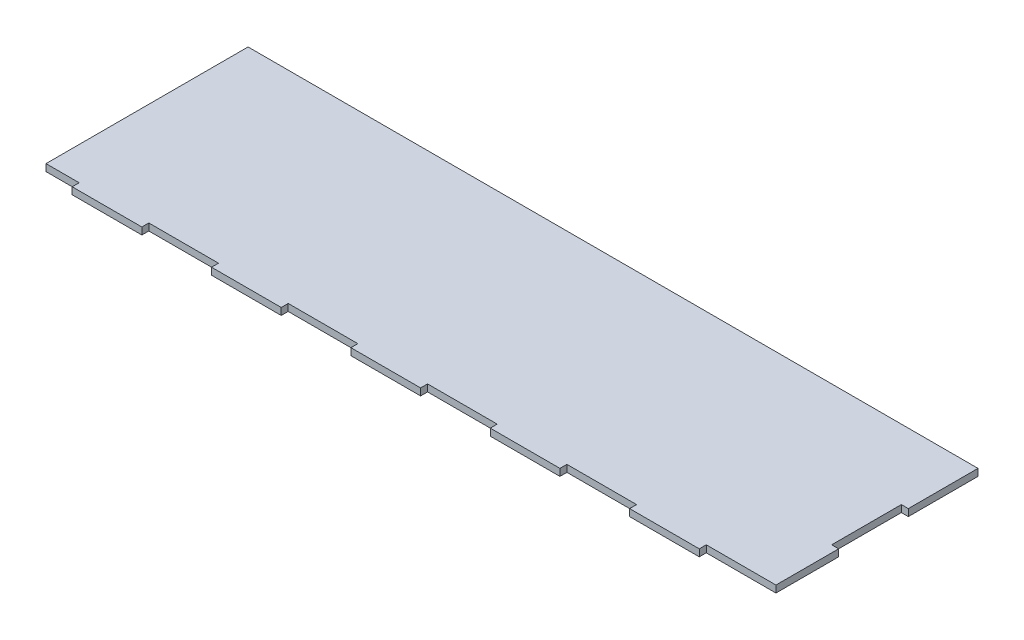
ISO-10303-21;
HEADER;
FILE_DESCRIPTION(('STEP AP214'),'2;1');
FILE_NAME('part.step','',(''),(''),'','','');
FILE_SCHEMA(('AUTOMOTIVE_DESIGN { 1 0 10303 214 1 1 1 1 }'));
ENDSEC;
DATA;
#1=APPLICATION_CONTEXT('core data for automotive mechanical design processes');
#2=APPLICATION_PROTOCOL_DEFINITION('international standard','automotive_design',2000,#1);
#3=PRODUCT_CONTEXT('',#1,'mechanical');
#4=PRODUCT('Part','Part','',(#3));
#5=PRODUCT_RELATED_PRODUCT_CATEGORY('part','',(#4));
#6=PRODUCT_DEFINITION_FORMATION('','',#4);
#7=PRODUCT_DEFINITION_CONTEXT('part definition',#1,'design');
#8=PRODUCT_DEFINITION('design','',#6,#7);
#9=PRODUCT_DEFINITION_SHAPE('','',#8);
#10=(LENGTH_UNIT() NAMED_UNIT(*) SI_UNIT(.MILLI.,.METRE.));
#11=(NAMED_UNIT(*) PLANE_ANGLE_UNIT() SI_UNIT($,.RADIAN.));
#12=(NAMED_UNIT(*) SI_UNIT($,.STERADIAN.) SOLID_ANGLE_UNIT());
#13=UNCERTAINTY_MEASURE_WITH_UNIT(LENGTH_MEASURE(1.E-05),#10,'distance_accuracy_value','');
#14=(GEOMETRIC_REPRESENTATION_CONTEXT(3) GLOBAL_UNCERTAINTY_ASSIGNED_CONTEXT((#13)) GLOBAL_UNIT_ASSIGNED_CONTEXT((#10,
#11,#12)) REPRESENTATION_CONTEXT('',''));
#15=CARTESIAN_POINT('',(0.,0.,0.));
#16=DIRECTION('',(0.,0.,1.));
#17=DIRECTION('',(1.,0.,0.));
#18=AXIS2_PLACEMENT_3D('',#15,#16,#17);
#19=CARTESIAN_POINT('',(0.725000000000031,0.,0.));
#20=DIRECTION('',(-1.,0.,0.));
#21=DIRECTION('',(0.,0.,1.));
#22=AXIS2_PLACEMENT_3D('',#19,#20,#21);
#23=PLANE('',#22);
#24=DIRECTION('',(0.,0.,-1.));
#25=VECTOR('',#24,1.);
#26=CARTESIAN_POINT('',(0.725000000000031,3.,0.));
#27=LINE('',#26,#25);
#28=CARTESIAN_POINT('',(0.725000000000031,3.,42.));
#29=VERTEX_POINT('',#28);
#30=CARTESIAN_POINT('',(0.725000000000031,3.,-45.));
#31=VERTEX_POINT('',#30);
#32=EDGE_CURVE('E242',#29,#31,#27,.T.);
#33=ORIENTED_EDGE('',*,*,#32,.T.);
#34=DIRECTION('',(0.,-1.,0.));
#35=VECTOR('',#34,1.);
#36=CARTESIAN_POINT('',(0.725000000000031,3.,-45.));
#37=LINE('',#36,#35);
#38=CARTESIAN_POINT('',(0.725000000000031,0.,-45.));
#39=VERTEX_POINT('',#38);
#40=EDGE_CURVE('E57',#31,#39,#37,.T.);
#41=ORIENTED_EDGE('',*,*,#40,.T.);
#42=DIRECTION('',(0.,0.,-1.));
#43=VECTOR('',#42,1.);
#44=CARTESIAN_POINT('',(0.725000000000031,0.,0.));
#45=LINE('',#44,#43);
#46=CARTESIAN_POINT('',(0.725000000000031,0.,42.));
#47=VERTEX_POINT('',#46);
#48=EDGE_CURVE('E65',#47,#39,#45,.T.);
#49=ORIENTED_EDGE('',*,*,#48,.F.);
#50=DIRECTION('',(0.,1.,0.));
#51=VECTOR('',#50,1.);
#52=CARTESIAN_POINT('',(0.725000000000031,0.,42.));
#53=LINE('',#52,#51);
#54=EDGE_CURVE('E12',#47,#29,#53,.T.);
#55=ORIENTED_EDGE('',*,*,#54,.T.);
#56=EDGE_LOOP('',(#33,#41,#49,#55));
#57=FACE_BOUND('',#56,.T.);
#58=ADVANCED_FACE('F41',(#57),#23,.T.);
#59=CARTESIAN_POINT('',(-315.,3.,-45.));
#60=DIRECTION('',(0.,0.,1.));
#61=DIRECTION('',(1.,0.,0.));
#62=AXIS2_PLACEMENT_3D('',#59,#60,#61);
#63=PLANE('',#62);
#64=ORIENTED_EDGE('',*,*,#40,.F.);
#65=DIRECTION('',(-1.,0.,0.));
#66=VECTOR('',#65,1.);
#67=CARTESIAN_POINT('',(-315.,3.,-45.));
#68=LINE('',#67,#66);
#69=CARTESIAN_POINT('',(315.,3.,-45.));
#70=VERTEX_POINT('',#69);
#71=EDGE_CURVE('E244',#70,#31,#68,.T.);
#72=ORIENTED_EDGE('',*,*,#71,.F.);
#73=DIRECTION('',(0.,-1.,0.));
#74=VECTOR('',#73,1.);
#75=CARTESIAN_POINT('',(315.,3.,-45.));
#76=LINE('',#75,#74);
#77=CARTESIAN_POINT('',(315.,0.,-45.));
#78=VERTEX_POINT('',#77);
#79=EDGE_CURVE('E486',#70,#78,#76,.T.);
#80=ORIENTED_EDGE('',*,*,#79,.T.);
#81=DIRECTION('',(-1.,0.,0.));
#82=VECTOR('',#81,1.);
#83=CARTESIAN_POINT('',(-315.,0.,-45.));
#84=LINE('',#83,#82);
#85=EDGE_CURVE('E477',#78,#39,#84,.T.);
#86=ORIENTED_EDGE('',*,*,#85,.T.);
#87=EDGE_LOOP('',(#64,#72,#80,#86));
#88=FACE_BOUND('',#87,.T.);
#89=ADVANCED_FACE('F569',(#88),#63,.F.);
#90=CARTESIAN_POINT('',(0.,3.,0.));
#91=DIRECTION('',(0.,-1.,0.));
#92=DIRECTION('',(0.,0.,-1.));
#93=AXIS2_PLACEMENT_3D('',#90,#91,#92);
#94=PLANE('',#93);
#95=ORIENTED_EDGE('',*,*,#32,.F.);
#96=DIRECTION('',(-1.,0.,0.));
#97=VECTOR('',#96,1.);
#98=CARTESIAN_POINT('',(-15.,3.,42.));
#99=LINE('',#98,#97);
#100=CARTESIAN_POINT('',(15.,3.,42.));
#101=VERTEX_POINT('',#100);
#102=EDGE_CURVE('E229',#101,#29,#99,.T.);
#103=ORIENTED_EDGE('',*,*,#102,.F.);
#104=DIRECTION('',(0.,0.,-1.));
#105=VECTOR('',#104,1.);
#106=CARTESIAN_POINT('',(15.,3.,45.));
#107=LINE('',#106,#105);
#108=CARTESIAN_POINT('',(15.,3.,45.));
#109=VERTEX_POINT('',#108);
#110=EDGE_CURVE('E239',#109,#101,#107,.T.);
#111=ORIENTED_EDGE('',*,*,#110,.F.);
#112=DIRECTION('',(1.,0.,0.));
#113=VECTOR('',#112,1.);
#114=CARTESIAN_POINT('',(-315.,3.,45.));
#115=LINE('',#114,#113);
#116=CARTESIAN_POINT('',(45.,3.,45.));
#117=VERTEX_POINT('',#116);
#118=EDGE_CURVE('E472',#109,#117,#115,.T.);
#119=ORIENTED_EDGE('',*,*,#118,.T.);
#120=DIRECTION('',(0.,0.,1.));
#121=VECTOR('',#120,1.);
#122=CARTESIAN_POINT('',(45.,3.,45.));
#123=LINE('',#122,#121);
#124=CARTESIAN_POINT('',(45.,3.,42.));
#125=VERTEX_POINT('',#124);
#126=EDGE_CURVE('E307',#125,#117,#123,.T.);
#127=ORIENTED_EDGE('',*,*,#126,.F.);
#128=DIRECTION('',(-1.,0.,0.));
#129=VECTOR('',#128,1.);
#130=CARTESIAN_POINT('',(45.,3.,42.));
#131=LINE('',#130,#129);
#132=CARTESIAN_POINT('',(75.,3.,42.));
#133=VERTEX_POINT('',#132);
#134=EDGE_CURVE('E298',#133,#125,#131,.T.);
#135=ORIENTED_EDGE('',*,*,#134,.F.);
#136=DIRECTION('',(0.,0.,-1.));
#137=VECTOR('',#136,1.);
#138=CARTESIAN_POINT('',(75.,3.,45.));
#139=LINE('',#138,#137);
#140=CARTESIAN_POINT('',(75.,3.,45.));
#141=VERTEX_POINT('',#140);
#142=EDGE_CURVE('E310',#141,#133,#139,.T.);
#143=ORIENTED_EDGE('',*,*,#142,.F.);
#144=CARTESIAN_POINT('',(105.,3.,45.));
#145=VERTEX_POINT('',#144);
#146=EDGE_CURVE('E837',#141,#145,#115,.T.);
#147=ORIENTED_EDGE('',*,*,#146,.T.);
#148=DIRECTION('',(0.,0.,1.));
#149=VECTOR('',#148,1.);
#150=CARTESIAN_POINT('',(105.,3.,45.));
#151=LINE('',#150,#149);
#152=CARTESIAN_POINT('',(105.,3.,42.));
#153=VERTEX_POINT('',#152);
#154=EDGE_CURVE('E343',#153,#145,#151,.T.);
#155=ORIENTED_EDGE('',*,*,#154,.F.);
#156=DIRECTION('',(-1.,0.,0.));
#157=VECTOR('',#156,1.);
#158=CARTESIAN_POINT('',(105.,3.,42.));
#159=LINE('',#158,#157);
#160=CARTESIAN_POINT('',(135.,3.,42.));
#161=VERTEX_POINT('',#160);
#162=EDGE_CURVE('E334',#161,#153,#159,.T.);
#163=ORIENTED_EDGE('',*,*,#162,.F.);
#164=DIRECTION('',(0.,0.,-1.));
#165=VECTOR('',#164,1.);
#166=CARTESIAN_POINT('',(135.,3.,45.));
#167=LINE('',#166,#165);
#168=CARTESIAN_POINT('',(135.,3.,45.));
#169=VERTEX_POINT('',#168);
#170=EDGE_CURVE('E346',#169,#161,#167,.T.);
#171=ORIENTED_EDGE('',*,*,#170,.F.);
#172=CARTESIAN_POINT('',(165.,3.,45.));
#173=VERTEX_POINT('',#172);
#174=EDGE_CURVE('E833',#169,#173,#115,.T.);
#175=ORIENTED_EDGE('',*,*,#174,.T.);
#176=DIRECTION('',(0.,0.,1.));
#177=VECTOR('',#176,1.);
#178=CARTESIAN_POINT('',(165.,3.,45.));
#179=LINE('',#178,#177);
#180=CARTESIAN_POINT('',(165.,3.,42.));
#181=VERTEX_POINT('',#180);
#182=EDGE_CURVE('E379',#181,#173,#179,.T.);
#183=ORIENTED_EDGE('',*,*,#182,.F.);
#184=DIRECTION('',(-1.,0.,0.));
#185=VECTOR('',#184,1.);
#186=CARTESIAN_POINT('',(165.,3.,42.));
#187=LINE('',#186,#185);
#188=CARTESIAN_POINT('',(195.,3.,42.));
#189=VERTEX_POINT('',#188);
#190=EDGE_CURVE('E370',#189,#181,#187,.T.);
#191=ORIENTED_EDGE('',*,*,#190,.F.);
#192=DIRECTION('',(0.,0.,-1.));
#193=VECTOR('',#192,1.);
#194=CARTESIAN_POINT('',(195.,3.,45.));
#195=LINE('',#194,#193);
#196=CARTESIAN_POINT('',(195.,3.,45.));
#197=VERTEX_POINT('',#196);
#198=EDGE_CURVE('E382',#197,#189,#195,.T.);
#199=ORIENTED_EDGE('',*,*,#198,.F.);
#200=CARTESIAN_POINT('',(225.,3.,45.));
#201=VERTEX_POINT('',#200);
#202=EDGE_CURVE('E471',#197,#201,#115,.T.);
#203=ORIENTED_EDGE('',*,*,#202,.T.);
#204=DIRECTION('',(0.,0.,1.));
#205=VECTOR('',#204,1.);
#206=CARTESIAN_POINT('',(225.,3.,45.));
#207=LINE('',#206,#205);
#208=CARTESIAN_POINT('',(225.,3.,42.));
#209=VERTEX_POINT('',#208);
#210=EDGE_CURVE('E415',#209,#201,#207,.T.);
#211=ORIENTED_EDGE('',*,*,#210,.F.);
#212=DIRECTION('',(-1.,0.,0.));
#213=VECTOR('',#212,1.);
#214=CARTESIAN_POINT('',(225.,3.,42.));
#215=LINE('',#214,#213);
#216=CARTESIAN_POINT('',(255.,3.,42.));
#217=VERTEX_POINT('',#216);
#218=EDGE_CURVE('E406',#217,#209,#215,.T.);
#219=ORIENTED_EDGE('',*,*,#218,.F.);
#220=DIRECTION('',(0.,0.,-1.));
#221=VECTOR('',#220,1.);
#222=CARTESIAN_POINT('',(255.,3.,45.));
#223=LINE('',#222,#221);
#224=CARTESIAN_POINT('',(255.,3.,45.));
#225=VERTEX_POINT('',#224);
#226=EDGE_CURVE('E418',#225,#217,#223,.T.);
#227=ORIENTED_EDGE('',*,*,#226,.F.);
#228=CARTESIAN_POINT('',(285.,3.,45.));
#229=VERTEX_POINT('',#228);
#230=EDGE_CURVE('E467',#225,#229,#115,.T.);
#231=ORIENTED_EDGE('',*,*,#230,.T.);
#232=DIRECTION('',(0.,0.,1.));
#233=VECTOR('',#232,1.);
#234=CARTESIAN_POINT('',(285.,3.,45.));
#235=LINE('',#234,#233);
#236=CARTESIAN_POINT('',(285.,3.,42.));
#237=VERTEX_POINT('',#236);
#238=EDGE_CURVE('E274',#237,#229,#235,.T.);
#239=ORIENTED_EDGE('',*,*,#238,.F.);
#240=DIRECTION('',(-1.,0.,0.));
#241=VECTOR('',#240,1.);
#242=CARTESIAN_POINT('',(285.,3.,42.));
#243=LINE('',#242,#241);
#244=CARTESIAN_POINT('',(315.,3.,42.));
#245=VERTEX_POINT('',#244);
#246=EDGE_CURVE('E442',#245,#237,#243,.T.);
#247=ORIENTED_EDGE('',*,*,#246,.F.);
#248=DIRECTION('',(0.,0.,-1.));
#249=VECTOR('',#248,1.);
#250=CARTESIAN_POINT('',(315.,3.,45.));
#251=LINE('',#250,#249);
#252=CARTESIAN_POINT('',(315.,3.,14.9999999985429));
#253=VERTEX_POINT('',#252);
#254=EDGE_CURVE('E460',#245,#253,#251,.T.);
#255=ORIENTED_EDGE('',*,*,#254,.T.);
#256=DIRECTION('',(-1.,0.,0.));
#257=VECTOR('',#256,1.);
#258=CARTESIAN_POINT('',(312.,3.,14.9999999985429));
#259=LINE('',#258,#257);
#260=CARTESIAN_POINT('',(312.,3.,14.9999999985429));
#261=VERTEX_POINT('',#260);
#262=EDGE_CURVE('E254',#253,#261,#259,.T.);
#263=ORIENTED_EDGE('',*,*,#262,.T.);
#264=DIRECTION('',(0.,0.,-1.));
#265=VECTOR('',#264,1.);
#266=CARTESIAN_POINT('',(312.,3.,14.9999999985429));
#267=LINE('',#266,#265);
#268=CARTESIAN_POINT('',(312.,3.,-15.0000000014571));
#269=VERTEX_POINT('',#268);
#270=EDGE_CURVE('E258',#261,#269,#267,.T.);
#271=ORIENTED_EDGE('',*,*,#270,.T.);
#272=DIRECTION('',(1.,0.,0.));
#273=VECTOR('',#272,1.);
#274=CARTESIAN_POINT('',(312.,3.,-15.0000000014571));
#275=LINE('',#274,#273);
#276=CARTESIAN_POINT('',(315.,3.,-15.0000000014571));
#277=VERTEX_POINT('',#276);
#278=EDGE_CURVE('E262',#269,#277,#275,.T.);
#279=ORIENTED_EDGE('',*,*,#278,.T.);
#280=EDGE_CURVE('E464',#277,#70,#251,.T.);
#281=ORIENTED_EDGE('',*,*,#280,.T.);
#282=ORIENTED_EDGE('',*,*,#71,.T.);
#283=EDGE_LOOP('',(#95,#103,#111,#119,#127,#135,#143,#147,#155,#163,#171,#175,#183,#191,#199,
#203,#211,#219,#227,#231,#239,#247,#255,#263,#271,#279,#281,#282));
#284=FACE_BOUND('',#283,.T.);
#285=ADVANCED_FACE('F243',(#284),#94,.F.);
#286=CARTESIAN_POINT('',(0.,0.,0.));
#287=DIRECTION('',(0.,-1.,0.));
#288=DIRECTION('',(0.,0.,-1.));
#289=AXIS2_PLACEMENT_3D('',#286,#287,#288);
#290=PLANE('',#289);
#291=DIRECTION('',(-1.,0.,0.));
#292=VECTOR('',#291,1.);
#293=CARTESIAN_POINT('',(-15.,0.,42.));
#294=LINE('',#293,#292);
#295=CARTESIAN_POINT('',(15.,0.,42.));
#296=VERTEX_POINT('',#295);
#297=EDGE_CURVE('E281',#296,#47,#294,.T.);
#298=ORIENTED_EDGE('',*,*,#297,.T.);
#299=ORIENTED_EDGE('',*,*,#48,.T.);
#300=ORIENTED_EDGE('',*,*,#85,.F.);
#301=DIRECTION('',(0.,0.,-1.));
#302=VECTOR('',#301,1.);
#303=CARTESIAN_POINT('',(315.,0.,45.));
#304=LINE('',#303,#302);
#305=CARTESIAN_POINT('',(315.,0.,-15.0000000014571));
#306=VERTEX_POINT('',#305);
#307=EDGE_CURVE('E290',#306,#78,#304,.T.);
#308=ORIENTED_EDGE('',*,*,#307,.F.);
#309=DIRECTION('',(1.,0.,0.));
#310=VECTOR('',#309,1.);
#311=CARTESIAN_POINT('',(0.,0.,-15.0000000014569));
#312=LINE('',#311,#310);
#313=CARTESIAN_POINT('',(312.,0.,-15.0000000014571));
#314=VERTEX_POINT('',#313);
#315=EDGE_CURVE('E50',#314,#306,#312,.T.);
#316=ORIENTED_EDGE('',*,*,#315,.F.);
#317=DIRECTION('',(0.,0.,-1.));
#318=VECTOR('',#317,1.);
#319=CARTESIAN_POINT('',(312.,0.,0.));
#320=LINE('',#319,#318);
#321=CARTESIAN_POINT('',(312.,0.,14.9999999985429));
#322=VERTEX_POINT('',#321);
#323=EDGE_CURVE('E494',#322,#314,#320,.T.);
#324=ORIENTED_EDGE('',*,*,#323,.F.);
#325=DIRECTION('',(-1.,0.,0.));
#326=VECTOR('',#325,1.);
#327=CARTESIAN_POINT('',(0.,0.,14.9999999985429));
#328=LINE('',#327,#326);
#329=CARTESIAN_POINT('',(315.,0.,14.9999999985429));
#330=VERTEX_POINT('',#329);
#331=EDGE_CURVE('E490',#330,#322,#328,.T.);
#332=ORIENTED_EDGE('',*,*,#331,.F.);
#333=CARTESIAN_POINT('',(315.,0.,42.));
#334=VERTEX_POINT('',#333);
#335=EDGE_CURVE('E473',#334,#330,#304,.T.);
#336=ORIENTED_EDGE('',*,*,#335,.F.);
#337=DIRECTION('',(-1.,0.,0.));
#338=VECTOR('',#337,1.);
#339=CARTESIAN_POINT('',(285.,0.,42.));
#340=LINE('',#339,#338);
#341=CARTESIAN_POINT('',(285.,0.,42.));
#342=VERTEX_POINT('',#341);
#343=EDGE_CURVE('E441',#334,#342,#340,.T.);
#344=ORIENTED_EDGE('',*,*,#343,.T.);
#345=DIRECTION('',(0.,0.,1.));
#346=VECTOR('',#345,1.);
#347=CARTESIAN_POINT('',(285.,0.,45.));
#348=LINE('',#347,#346);
#349=CARTESIAN_POINT('',(285.,0.,45.));
#350=VERTEX_POINT('',#349);
#351=EDGE_CURVE('E437',#342,#350,#348,.T.);
#352=ORIENTED_EDGE('',*,*,#351,.T.);
#353=DIRECTION('',(1.,0.,0.));
#354=VECTOR('',#353,1.);
#355=CARTESIAN_POINT('',(-315.,0.,45.));
#356=LINE('',#355,#354);
#357=CARTESIAN_POINT('',(255.,0.,45.));
#358=VERTEX_POINT('',#357);
#359=EDGE_CURVE('E480',#358,#350,#356,.T.);
#360=ORIENTED_EDGE('',*,*,#359,.F.);
#361=DIRECTION('',(0.,0.,-1.));
#362=VECTOR('',#361,1.);
#363=CARTESIAN_POINT('',(255.,0.,45.));
#364=LINE('',#363,#362);
#365=CARTESIAN_POINT('',(255.,0.,42.));
#366=VERTEX_POINT('',#365);
#367=EDGE_CURVE('E405',#358,#366,#364,.T.);
#368=ORIENTED_EDGE('',*,*,#367,.T.);
#369=DIRECTION('',(-1.,0.,0.));
#370=VECTOR('',#369,1.);
#371=CARTESIAN_POINT('',(225.,0.,42.));
#372=LINE('',#371,#370);
#373=CARTESIAN_POINT('',(225.,0.,42.));
#374=VERTEX_POINT('',#373);
#375=EDGE_CURVE('E410',#366,#374,#372,.T.);
#376=ORIENTED_EDGE('',*,*,#375,.T.);
#377=DIRECTION('',(0.,0.,1.));
#378=VECTOR('',#377,1.);
#379=CARTESIAN_POINT('',(225.,0.,45.));
#380=LINE('',#379,#378);
#381=CARTESIAN_POINT('',(225.,0.,45.));
#382=VERTEX_POINT('',#381);
#383=EDGE_CURVE('E401',#374,#382,#380,.T.);
#384=ORIENTED_EDGE('',*,*,#383,.T.);
#385=CARTESIAN_POINT('',(195.,0.,45.));
#386=VERTEX_POINT('',#385);
#387=EDGE_CURVE('E484',#386,#382,#356,.T.);
#388=ORIENTED_EDGE('',*,*,#387,.F.);
#389=DIRECTION('',(0.,0.,-1.));
#390=VECTOR('',#389,1.);
#391=CARTESIAN_POINT('',(195.,0.,45.));
#392=LINE('',#391,#390);
#393=CARTESIAN_POINT('',(195.,0.,42.));
#394=VERTEX_POINT('',#393);
#395=EDGE_CURVE('E369',#386,#394,#392,.T.);
#396=ORIENTED_EDGE('',*,*,#395,.T.);
#397=DIRECTION('',(-1.,0.,0.));
#398=VECTOR('',#397,1.);
#399=CARTESIAN_POINT('',(165.,0.,42.));
#400=LINE('',#399,#398);
#401=CARTESIAN_POINT('',(165.,0.,42.));
#402=VERTEX_POINT('',#401);
#403=EDGE_CURVE('E374',#394,#402,#400,.T.);
#404=ORIENTED_EDGE('',*,*,#403,.T.);
#405=DIRECTION('',(0.,0.,1.));
#406=VECTOR('',#405,1.);
#407=CARTESIAN_POINT('',(165.,0.,45.));
#408=LINE('',#407,#406);
#409=CARTESIAN_POINT('',(165.,0.,45.));
#410=VERTEX_POINT('',#409);
#411=EDGE_CURVE('E365',#402,#410,#408,.T.);
#412=ORIENTED_EDGE('',*,*,#411,.T.);
#413=CARTESIAN_POINT('',(135.,0.,45.));
#414=VERTEX_POINT('',#413);
#415=EDGE_CURVE('E548',#414,#410,#356,.T.);
#416=ORIENTED_EDGE('',*,*,#415,.F.);
#417=DIRECTION('',(0.,0.,-1.));
#418=VECTOR('',#417,1.);
#419=CARTESIAN_POINT('',(135.,0.,45.));
#420=LINE('',#419,#418);
#421=CARTESIAN_POINT('',(135.,0.,42.));
#422=VERTEX_POINT('',#421);
#423=EDGE_CURVE('E333',#414,#422,#420,.T.);
#424=ORIENTED_EDGE('',*,*,#423,.T.);
#425=DIRECTION('',(-1.,0.,0.));
#426=VECTOR('',#425,1.);
#427=CARTESIAN_POINT('',(105.,0.,42.));
#428=LINE('',#427,#426);
#429=CARTESIAN_POINT('',(105.,0.,42.));
#430=VERTEX_POINT('',#429);
#431=EDGE_CURVE('E338',#422,#430,#428,.T.);
#432=ORIENTED_EDGE('',*,*,#431,.T.);
#433=DIRECTION('',(0.,0.,1.));
#434=VECTOR('',#433,1.);
#435=CARTESIAN_POINT('',(105.,0.,45.));
#436=LINE('',#435,#434);
#437=CARTESIAN_POINT('',(105.,0.,45.));
#438=VERTEX_POINT('',#437);
#439=EDGE_CURVE('E329',#430,#438,#436,.T.);
#440=ORIENTED_EDGE('',*,*,#439,.T.);
#441=CARTESIAN_POINT('',(75.,0.,45.));
#442=VERTEX_POINT('',#441);
#443=EDGE_CURVE('E551',#442,#438,#356,.T.);
#444=ORIENTED_EDGE('',*,*,#443,.F.);
#445=DIRECTION('',(0.,0.,-1.));
#446=VECTOR('',#445,1.);
#447=CARTESIAN_POINT('',(75.,0.,45.));
#448=LINE('',#447,#446);
#449=CARTESIAN_POINT('',(75.,0.,42.));
#450=VERTEX_POINT('',#449);
#451=EDGE_CURVE('E297',#442,#450,#448,.T.);
#452=ORIENTED_EDGE('',*,*,#451,.T.);
#453=DIRECTION('',(-1.,0.,0.));
#454=VECTOR('',#453,1.);
#455=CARTESIAN_POINT('',(45.,0.,42.));
#456=LINE('',#455,#454);
#457=CARTESIAN_POINT('',(45.,0.,42.));
#458=VERTEX_POINT('',#457);
#459=EDGE_CURVE('E302',#450,#458,#456,.T.);
#460=ORIENTED_EDGE('',*,*,#459,.T.);
#461=DIRECTION('',(0.,0.,1.));
#462=VECTOR('',#461,1.);
#463=CARTESIAN_POINT('',(45.,0.,45.));
#464=LINE('',#463,#462);
#465=CARTESIAN_POINT('',(45.,0.,45.));
#466=VERTEX_POINT('',#465);
#467=EDGE_CURVE('E293',#458,#466,#464,.T.);
#468=ORIENTED_EDGE('',*,*,#467,.T.);
#469=CARTESIAN_POINT('',(15.,0.,45.));
#470=VERTEX_POINT('',#469);
#471=EDGE_CURVE('E485',#470,#466,#356,.T.);
#472=ORIENTED_EDGE('',*,*,#471,.F.);
#473=DIRECTION('',(0.,0.,-1.));
#474=VECTOR('',#473,1.);
#475=CARTESIAN_POINT('',(15.,0.,45.));
#476=LINE('',#475,#474);
#477=EDGE_CURVE('E238',#470,#296,#476,.T.);
#478=ORIENTED_EDGE('',*,*,#477,.T.);
#479=EDGE_LOOP('',(#298,#299,#300,#308,#316,#324,#332,#336,#344,#352,#360,#368,#376,#384,#388,
#396,#404,#412,#416,#424,#432,#440,#444,#452,#460,#468,#472,#478));
#480=FACE_BOUND('',#479,.T.);
#481=ADVANCED_FACE('F505',(#480),#290,.T.);
#482=CARTESIAN_POINT('',(-15.,0.,42.));
#483=DIRECTION('',(0.,0.,-1.));
#484=DIRECTION('',(-1.,0.,0.));
#485=AXIS2_PLACEMENT_3D('',#482,#483,#484);
#486=PLANE('',#485);
#487=ORIENTED_EDGE('',*,*,#54,.F.);
#488=ORIENTED_EDGE('',*,*,#297,.F.);
#489=DIRECTION('',(0.,1.,0.));
#490=VECTOR('',#489,1.);
#491=CARTESIAN_POINT('',(15.,0.,42.));
#492=LINE('',#491,#490);
#493=EDGE_CURVE('E233',#296,#101,#492,.T.);
#494=ORIENTED_EDGE('',*,*,#493,.T.);
#495=ORIENTED_EDGE('',*,*,#102,.T.);
#496=EDGE_LOOP('',(#487,#488,#494,#495));
#497=FACE_BOUND('',#496,.T.);
#498=ADVANCED_FACE('F231',(#497),#486,.F.);
#499=CARTESIAN_POINT('',(315.,3.,45.));
#500=DIRECTION('',(-1.,0.,0.));
#501=DIRECTION('',(0.,0.,1.));
#502=AXIS2_PLACEMENT_3D('',#499,#500,#501);
#503=PLANE('',#502);
#504=ORIENTED_EDGE('',*,*,#280,.F.);
#505=DIRECTION('',(0.,-1.,0.));
#506=VECTOR('',#505,1.);
#507=CARTESIAN_POINT('',(315.,3.,-15.0000000014571));
#508=LINE('',#507,#506);
#509=EDGE_CURVE('E265',#277,#306,#508,.T.);
#510=ORIENTED_EDGE('',*,*,#509,.T.);
#511=ORIENTED_EDGE('',*,*,#307,.T.);
#512=ORIENTED_EDGE('',*,*,#79,.F.);
#513=EDGE_LOOP('',(#504,#510,#511,#512));
#514=FACE_BOUND('',#513,.T.);
#515=ADVANCED_FACE('F570',(#514),#503,.F.);
#516=CARTESIAN_POINT('',(-315.,3.,45.));
#517=DIRECTION('',(0.,0.,-1.));
#518=DIRECTION('',(-1.,0.,0.));
#519=AXIS2_PLACEMENT_3D('',#516,#517,#518);
#520=PLANE('',#519);
#521=ORIENTED_EDGE('',*,*,#387,.T.);
#522=DIRECTION('',(0.,1.,0.));
#523=VECTOR('',#522,1.);
#524=CARTESIAN_POINT('',(225.,0.,45.));
#525=LINE('',#524,#523);
#526=EDGE_CURVE('E414',#382,#201,#525,.T.);
#527=ORIENTED_EDGE('',*,*,#526,.T.);
#528=ORIENTED_EDGE('',*,*,#202,.F.);
#529=DIRECTION('',(0.,1.,0.));
#530=VECTOR('',#529,1.);
#531=CARTESIAN_POINT('',(195.,0.,45.));
#532=LINE('',#531,#530);
#533=EDGE_CURVE('E395',#386,#197,#532,.T.);
#534=ORIENTED_EDGE('',*,*,#533,.F.);
#535=EDGE_LOOP('',(#521,#527,#528,#534));
#536=FACE_BOUND('',#535,.T.);
#537=ADVANCED_FACE('F544',(#536),#520,.F.);
#538=ORIENTED_EDGE('',*,*,#415,.T.);
#539=DIRECTION('',(0.,1.,0.));
#540=VECTOR('',#539,1.);
#541=CARTESIAN_POINT('',(165.,0.,45.));
#542=LINE('',#541,#540);
#543=EDGE_CURVE('E378',#410,#173,#542,.T.);
#544=ORIENTED_EDGE('',*,*,#543,.T.);
#545=ORIENTED_EDGE('',*,*,#174,.F.);
#546=DIRECTION('',(0.,1.,0.));
#547=VECTOR('',#546,1.);
#548=CARTESIAN_POINT('',(135.,0.,45.));
#549=LINE('',#548,#547);
#550=EDGE_CURVE('E359',#414,#169,#549,.T.);
#551=ORIENTED_EDGE('',*,*,#550,.F.);
#552=EDGE_LOOP('',(#538,#544,#545,#551));
#553=FACE_BOUND('',#552,.T.);
#554=ADVANCED_FACE('F577',(#553),#520,.F.);
#555=ORIENTED_EDGE('',*,*,#443,.T.);
#556=DIRECTION('',(0.,1.,0.));
#557=VECTOR('',#556,1.);
#558=CARTESIAN_POINT('',(105.,0.,45.));
#559=LINE('',#558,#557);
#560=EDGE_CURVE('E342',#438,#145,#559,.T.);
#561=ORIENTED_EDGE('',*,*,#560,.T.);
#562=ORIENTED_EDGE('',*,*,#146,.F.);
#563=DIRECTION('',(0.,1.,0.));
#564=VECTOR('',#563,1.);
#565=CARTESIAN_POINT('',(75.,0.,45.));
#566=LINE('',#565,#564);
#567=EDGE_CURVE('E323',#442,#141,#566,.T.);
#568=ORIENTED_EDGE('',*,*,#567,.F.);
#569=EDGE_LOOP('',(#555,#561,#562,#568));
#570=FACE_BOUND('',#569,.T.);
#571=ADVANCED_FACE('F651',(#570),#520,.F.);
#572=ORIENTED_EDGE('',*,*,#471,.T.);
#573=DIRECTION('',(0.,1.,0.));
#574=VECTOR('',#573,1.);
#575=CARTESIAN_POINT('',(45.,0.,45.));
#576=LINE('',#575,#574);
#577=EDGE_CURVE('E306',#466,#117,#576,.T.);
#578=ORIENTED_EDGE('',*,*,#577,.T.);
#579=ORIENTED_EDGE('',*,*,#118,.F.);
#580=DIRECTION('',(0.,1.,0.));
#581=VECTOR('',#580,1.);
#582=CARTESIAN_POINT('',(15.,0.,45.));
#583=LINE('',#582,#581);
#584=EDGE_CURVE('E284',#470,#109,#583,.T.);
#585=ORIENTED_EDGE('',*,*,#584,.F.);
#586=EDGE_LOOP('',(#572,#578,#579,#585));
#587=FACE_BOUND('',#586,.T.);
#588=ADVANCED_FACE('F581',(#587),#520,.F.);
#589=ORIENTED_EDGE('',*,*,#335,.T.);
#590=DIRECTION('',(0.,-1.,0.));
#591=VECTOR('',#590,1.);
#592=CARTESIAN_POINT('',(315.,3.,14.9999999985429));
#593=LINE('',#592,#591);
#594=EDGE_CURVE('E253',#253,#330,#593,.T.);
#595=ORIENTED_EDGE('',*,*,#594,.F.);
#596=ORIENTED_EDGE('',*,*,#254,.F.);
#597=DIRECTION('',(0.,1.,0.));
#598=VECTOR('',#597,1.);
#599=CARTESIAN_POINT('',(315.,0.,42.));
#600=LINE('',#599,#598);
#601=EDGE_CURVE('E454',#334,#245,#600,.T.);
#602=ORIENTED_EDGE('',*,*,#601,.F.);
#603=EDGE_LOOP('',(#589,#595,#596,#602));
#604=FACE_BOUND('',#603,.T.);
#605=ADVANCED_FACE('F43',(#604),#503,.F.);
#606=ORIENTED_EDGE('',*,*,#359,.T.);
#607=DIRECTION('',(0.,1.,0.));
#608=VECTOR('',#607,1.);
#609=CARTESIAN_POINT('',(285.,0.,45.));
#610=LINE('',#609,#608);
#611=EDGE_CURVE('E446',#350,#229,#610,.T.);
#612=ORIENTED_EDGE('',*,*,#611,.T.);
#613=ORIENTED_EDGE('',*,*,#230,.F.);
#614=DIRECTION('',(0.,1.,0.));
#615=VECTOR('',#614,1.);
#616=CARTESIAN_POINT('',(255.,0.,45.));
#617=LINE('',#616,#615);
#618=EDGE_CURVE('E431',#358,#225,#617,.T.);
#619=ORIENTED_EDGE('',*,*,#618,.F.);
#620=EDGE_LOOP('',(#606,#612,#613,#619));
#621=FACE_BOUND('',#620,.T.);
#622=ADVANCED_FACE('F527',(#621),#520,.F.);
#623=CARTESIAN_POINT('',(15.,0.,45.));
#624=DIRECTION('',(1.,0.,0.));
#625=DIRECTION('',(0.,0.,-1.));
#626=AXIS2_PLACEMENT_3D('',#623,#624,#625);
#627=PLANE('',#626);
#628=ORIENTED_EDGE('',*,*,#110,.T.);
#629=ORIENTED_EDGE('',*,*,#493,.F.);
#630=ORIENTED_EDGE('',*,*,#477,.F.);
#631=ORIENTED_EDGE('',*,*,#584,.T.);
#632=EDGE_LOOP('',(#628,#629,#630,#631));
#633=FACE_BOUND('',#632,.T.);
#634=ADVANCED_FACE('F594',(#633),#627,.F.);
#635=CARTESIAN_POINT('',(45.,0.,45.));
#636=DIRECTION('',(-1.,0.,0.));
#637=DIRECTION('',(0.,0.,1.));
#638=AXIS2_PLACEMENT_3D('',#635,#636,#637);
#639=PLANE('',#638);
#640=ORIENTED_EDGE('',*,*,#126,.T.);
#641=ORIENTED_EDGE('',*,*,#577,.F.);
#642=ORIENTED_EDGE('',*,*,#467,.F.);
#643=DIRECTION('',(0.,1.,0.));
#644=VECTOR('',#643,1.);
#645=CARTESIAN_POINT('',(45.,0.,42.));
#646=LINE('',#645,#644);
#647=EDGE_CURVE('E286',#458,#125,#646,.T.);
#648=ORIENTED_EDGE('',*,*,#647,.T.);
#649=EDGE_LOOP('',(#640,#641,#642,#648));
#650=FACE_BOUND('',#649,.T.);
#651=ADVANCED_FACE('F597',(#650),#639,.F.);
#652=CARTESIAN_POINT('',(45.,0.,42.));
#653=DIRECTION('',(0.,0.,-1.));
#654=DIRECTION('',(-1.,0.,0.));
#655=AXIS2_PLACEMENT_3D('',#652,#653,#654);
#656=PLANE('',#655);
#657=ORIENTED_EDGE('',*,*,#134,.T.);
#658=ORIENTED_EDGE('',*,*,#647,.F.);
#659=ORIENTED_EDGE('',*,*,#459,.F.);
#660=DIRECTION('',(0.,1.,0.));
#661=VECTOR('',#660,1.);
#662=CARTESIAN_POINT('',(75.,0.,42.));
#663=LINE('',#662,#661);
#664=EDGE_CURVE('E320',#450,#133,#663,.T.);
#665=ORIENTED_EDGE('',*,*,#664,.T.);
#666=EDGE_LOOP('',(#657,#658,#659,#665));
#667=FACE_BOUND('',#666,.T.);
#668=ADVANCED_FACE('F599',(#667),#656,.F.);
#669=CARTESIAN_POINT('',(75.,0.,45.));
#670=DIRECTION('',(1.,0.,0.));
#671=DIRECTION('',(0.,0.,-1.));
#672=AXIS2_PLACEMENT_3D('',#669,#670,#671);
#673=PLANE('',#672);
#674=ORIENTED_EDGE('',*,*,#142,.T.);
#675=ORIENTED_EDGE('',*,*,#664,.F.);
#676=ORIENTED_EDGE('',*,*,#451,.F.);
#677=ORIENTED_EDGE('',*,*,#567,.T.);
#678=EDGE_LOOP('',(#674,#675,#676,#677));
#679=FACE_BOUND('',#678,.T.);
#680=ADVANCED_FACE('F602',(#679),#673,.F.);
#681=CARTESIAN_POINT('',(105.,0.,45.));
#682=DIRECTION('',(-1.,0.,0.));
#683=DIRECTION('',(0.,0.,1.));
#684=AXIS2_PLACEMENT_3D('',#681,#682,#683);
#685=PLANE('',#684);
#686=ORIENTED_EDGE('',*,*,#154,.T.);
#687=ORIENTED_EDGE('',*,*,#560,.F.);
#688=ORIENTED_EDGE('',*,*,#439,.F.);
#689=DIRECTION('',(0.,1.,0.));
#690=VECTOR('',#689,1.);
#691=CARTESIAN_POINT('',(105.,0.,42.));
#692=LINE('',#691,#690);
#693=EDGE_CURVE('E311',#430,#153,#692,.T.);
#694=ORIENTED_EDGE('',*,*,#693,.T.);
#695=EDGE_LOOP('',(#686,#687,#688,#694));
#696=FACE_BOUND('',#695,.T.);
#697=ADVANCED_FACE('F606',(#696),#685,.F.);
#698=CARTESIAN_POINT('',(105.,0.,42.));
#699=DIRECTION('',(0.,0.,-1.));
#700=DIRECTION('',(-1.,0.,0.));
#701=AXIS2_PLACEMENT_3D('',#698,#699,#700);
#702=PLANE('',#701);
#703=ORIENTED_EDGE('',*,*,#162,.T.);
#704=ORIENTED_EDGE('',*,*,#693,.F.);
#705=ORIENTED_EDGE('',*,*,#431,.F.);
#706=DIRECTION('',(0.,1.,0.));
#707=VECTOR('',#706,1.);
#708=CARTESIAN_POINT('',(135.,0.,42.));
#709=LINE('',#708,#707);
#710=EDGE_CURVE('E356',#422,#161,#709,.T.);
#711=ORIENTED_EDGE('',*,*,#710,.T.);
#712=EDGE_LOOP('',(#703,#704,#705,#711));
#713=FACE_BOUND('',#712,.T.);
#714=ADVANCED_FACE('F611',(#713),#702,.F.);
#715=CARTESIAN_POINT('',(135.,0.,45.));
#716=DIRECTION('',(1.,0.,0.));
#717=DIRECTION('',(0.,0.,-1.));
#718=AXIS2_PLACEMENT_3D('',#715,#716,#717);
#719=PLANE('',#718);
#720=ORIENTED_EDGE('',*,*,#170,.T.);
#721=ORIENTED_EDGE('',*,*,#710,.F.);
#722=ORIENTED_EDGE('',*,*,#423,.F.);
#723=ORIENTED_EDGE('',*,*,#550,.T.);
#724=EDGE_LOOP('',(#720,#721,#722,#723));
#725=FACE_BOUND('',#724,.T.);
#726=ADVANCED_FACE('F614',(#725),#719,.F.);
#727=CARTESIAN_POINT('',(165.,0.,45.));
#728=DIRECTION('',(-1.,0.,0.));
#729=DIRECTION('',(0.,0.,1.));
#730=AXIS2_PLACEMENT_3D('',#727,#728,#729);
#731=PLANE('',#730);
#732=ORIENTED_EDGE('',*,*,#182,.T.);
#733=ORIENTED_EDGE('',*,*,#543,.F.);
#734=ORIENTED_EDGE('',*,*,#411,.F.);
#735=DIRECTION('',(0.,1.,0.));
#736=VECTOR('',#735,1.);
#737=CARTESIAN_POINT('',(165.,0.,42.));
#738=LINE('',#737,#736);
#739=EDGE_CURVE('E347',#402,#181,#738,.T.);
#740=ORIENTED_EDGE('',*,*,#739,.T.);
#741=EDGE_LOOP('',(#732,#733,#734,#740));
#742=FACE_BOUND('',#741,.T.);
#743=ADVANCED_FACE('F618',(#742),#731,.F.);
#744=CARTESIAN_POINT('',(165.,0.,42.));
#745=DIRECTION('',(0.,0.,-1.));
#746=DIRECTION('',(-1.,0.,0.));
#747=AXIS2_PLACEMENT_3D('',#744,#745,#746);
#748=PLANE('',#747);
#749=ORIENTED_EDGE('',*,*,#190,.T.);
#750=ORIENTED_EDGE('',*,*,#739,.F.);
#751=ORIENTED_EDGE('',*,*,#403,.F.);
#752=DIRECTION('',(0.,1.,0.));
#753=VECTOR('',#752,1.);
#754=CARTESIAN_POINT('',(195.,0.,42.));
#755=LINE('',#754,#753);
#756=EDGE_CURVE('E392',#394,#189,#755,.T.);
#757=ORIENTED_EDGE('',*,*,#756,.T.);
#758=EDGE_LOOP('',(#749,#750,#751,#757));
#759=FACE_BOUND('',#758,.T.);
#760=ADVANCED_FACE('F623',(#759),#748,.F.);
#761=CARTESIAN_POINT('',(195.,0.,45.));
#762=DIRECTION('',(1.,0.,0.));
#763=DIRECTION('',(0.,0.,-1.));
#764=AXIS2_PLACEMENT_3D('',#761,#762,#763);
#765=PLANE('',#764);
#766=ORIENTED_EDGE('',*,*,#198,.T.);
#767=ORIENTED_EDGE('',*,*,#756,.F.);
#768=ORIENTED_EDGE('',*,*,#395,.F.);
#769=ORIENTED_EDGE('',*,*,#533,.T.);
#770=EDGE_LOOP('',(#766,#767,#768,#769));
#771=FACE_BOUND('',#770,.T.);
#772=ADVANCED_FACE('F626',(#771),#765,.F.);
#773=CARTESIAN_POINT('',(225.,0.,45.));
#774=DIRECTION('',(-1.,0.,0.));
#775=DIRECTION('',(0.,0.,1.));
#776=AXIS2_PLACEMENT_3D('',#773,#774,#775);
#777=PLANE('',#776);
#778=ORIENTED_EDGE('',*,*,#210,.T.);
#779=ORIENTED_EDGE('',*,*,#526,.F.);
#780=ORIENTED_EDGE('',*,*,#383,.F.);
#781=DIRECTION('',(0.,1.,0.));
#782=VECTOR('',#781,1.);
#783=CARTESIAN_POINT('',(225.,0.,42.));
#784=LINE('',#783,#782);
#785=EDGE_CURVE('E383',#374,#209,#784,.T.);
#786=ORIENTED_EDGE('',*,*,#785,.T.);
#787=EDGE_LOOP('',(#778,#779,#780,#786));
#788=FACE_BOUND('',#787,.T.);
#789=ADVANCED_FACE('F539',(#788),#777,.F.);
#790=CARTESIAN_POINT('',(225.,0.,42.));
#791=DIRECTION('',(0.,0.,-1.));
#792=DIRECTION('',(-1.,0.,0.));
#793=AXIS2_PLACEMENT_3D('',#790,#791,#792);
#794=PLANE('',#793);
#795=ORIENTED_EDGE('',*,*,#218,.T.);
#796=ORIENTED_EDGE('',*,*,#785,.F.);
#797=ORIENTED_EDGE('',*,*,#375,.F.);
#798=DIRECTION('',(0.,1.,0.));
#799=VECTOR('',#798,1.);
#800=CARTESIAN_POINT('',(255.,0.,42.));
#801=LINE('',#800,#799);
#802=EDGE_CURVE('E428',#366,#217,#801,.T.);
#803=ORIENTED_EDGE('',*,*,#802,.T.);
#804=EDGE_LOOP('',(#795,#796,#797,#803));
#805=FACE_BOUND('',#804,.T.);
#806=ADVANCED_FACE('F535',(#805),#794,.F.);
#807=CARTESIAN_POINT('',(255.,0.,45.));
#808=DIRECTION('',(1.,0.,0.));
#809=DIRECTION('',(0.,0.,-1.));
#810=AXIS2_PLACEMENT_3D('',#807,#808,#809);
#811=PLANE('',#810);
#812=ORIENTED_EDGE('',*,*,#226,.T.);
#813=ORIENTED_EDGE('',*,*,#802,.F.);
#814=ORIENTED_EDGE('',*,*,#367,.F.);
#815=ORIENTED_EDGE('',*,*,#618,.T.);
#816=EDGE_LOOP('',(#812,#813,#814,#815));
#817=FACE_BOUND('',#816,.T.);
#818=ADVANCED_FACE('F532',(#817),#811,.F.);
#819=CARTESIAN_POINT('',(285.,0.,45.));
#820=DIRECTION('',(-1.,0.,0.));
#821=DIRECTION('',(0.,0.,1.));
#822=AXIS2_PLACEMENT_3D('',#819,#820,#821);
#823=PLANE('',#822);
#824=ORIENTED_EDGE('',*,*,#238,.T.);
#825=ORIENTED_EDGE('',*,*,#611,.F.);
#826=ORIENTED_EDGE('',*,*,#351,.F.);
#827=DIRECTION('',(0.,1.,0.));
#828=VECTOR('',#827,1.);
#829=CARTESIAN_POINT('',(285.,0.,42.));
#830=LINE('',#829,#828);
#831=EDGE_CURVE('E419',#342,#237,#830,.T.);
#832=ORIENTED_EDGE('',*,*,#831,.T.);
#833=EDGE_LOOP('',(#824,#825,#826,#832));
#834=FACE_BOUND('',#833,.T.);
#835=ADVANCED_FACE('F525',(#834),#823,.F.);
#836=CARTESIAN_POINT('',(285.,0.,42.));
#837=DIRECTION('',(0.,0.,-1.));
#838=DIRECTION('',(-1.,0.,0.));
#839=AXIS2_PLACEMENT_3D('',#836,#837,#838);
#840=PLANE('',#839);
#841=ORIENTED_EDGE('',*,*,#246,.T.);
#842=ORIENTED_EDGE('',*,*,#831,.F.);
#843=ORIENTED_EDGE('',*,*,#343,.F.);
#844=ORIENTED_EDGE('',*,*,#601,.T.);
#845=EDGE_LOOP('',(#841,#842,#843,#844));
#846=FACE_BOUND('',#845,.T.);
#847=ADVANCED_FACE('F519',(#846),#840,.F.);
#848=CARTESIAN_POINT('',(312.,3.,-15.0000000014571));
#849=DIRECTION('',(0.,0.,-1.));
#850=DIRECTION('',(-1.,0.,0.));
#851=AXIS2_PLACEMENT_3D('',#848,#849,#850);
#852=PLANE('',#851);
#853=DIRECTION('',(0.,-1.,0.));
#854=VECTOR('',#853,1.);
#855=CARTESIAN_POINT('',(312.,3.,-15.0000000014571));
#856=LINE('',#855,#854);
#857=EDGE_CURVE('E261',#269,#314,#856,.T.);
#858=ORIENTED_EDGE('',*,*,#857,.T.);
#859=ORIENTED_EDGE('',*,*,#315,.T.);
#860=ORIENTED_EDGE('',*,*,#509,.F.);
#861=ORIENTED_EDGE('',*,*,#278,.F.);
#862=EDGE_LOOP('',(#858,#859,#860,#861));
#863=FACE_BOUND('',#862,.T.);
#864=ADVANCED_FACE('F501',(#863),#852,.F.);
#865=CARTESIAN_POINT('',(312.,3.,14.9999999985429));
#866=DIRECTION('',(-1.,0.,0.));
#867=DIRECTION('',(0.,0.,1.));
#868=AXIS2_PLACEMENT_3D('',#865,#866,#867);
#869=PLANE('',#868);
#870=DIRECTION('',(0.,-1.,0.));
#871=VECTOR('',#870,1.);
#872=CARTESIAN_POINT('',(312.,3.,14.9999999985429));
#873=LINE('',#872,#871);
#874=EDGE_CURVE('E257',#261,#322,#873,.T.);
#875=ORIENTED_EDGE('',*,*,#874,.T.);
#876=ORIENTED_EDGE('',*,*,#323,.T.);
#877=ORIENTED_EDGE('',*,*,#857,.F.);
#878=ORIENTED_EDGE('',*,*,#270,.F.);
#879=EDGE_LOOP('',(#875,#876,#877,#878));
#880=FACE_BOUND('',#879,.T.);
#881=ADVANCED_FACE('F507',(#880),#869,.F.);
#882=CARTESIAN_POINT('',(312.,3.,14.9999999985429));
#883=DIRECTION('',(0.,0.,1.));
#884=DIRECTION('',(1.,0.,0.));
#885=AXIS2_PLACEMENT_3D('',#882,#883,#884);
#886=PLANE('',#885);
#887=ORIENTED_EDGE('',*,*,#594,.T.);
#888=ORIENTED_EDGE('',*,*,#331,.T.);
#889=ORIENTED_EDGE('',*,*,#874,.F.);
#890=ORIENTED_EDGE('',*,*,#262,.F.);
#891=EDGE_LOOP('',(#887,#888,#889,#890));
#892=FACE_BOUND('',#891,.T.);
#893=ADVANCED_FACE('F512',(#892),#886,.F.);
#894=CLOSED_SHELL('',(#58,#89,#285,#481,#498,#515,#537,#554,#571,#588,#605,#622,#634,#651,#668,
#680,#697,#714,#726,#743,#760,#772,#789,#806,#818,#835,#847,#864,#881,#893));
#895=MANIFOLD_SOLID_BREP('B2',#894);
#896=ADVANCED_BREP_SHAPE_REPRESENTATION('',(#18,#895),#14);
#897=SHAPE_DEFINITION_REPRESENTATION(#9,#896);
ENDSEC;
END-ISO-10303-21;
